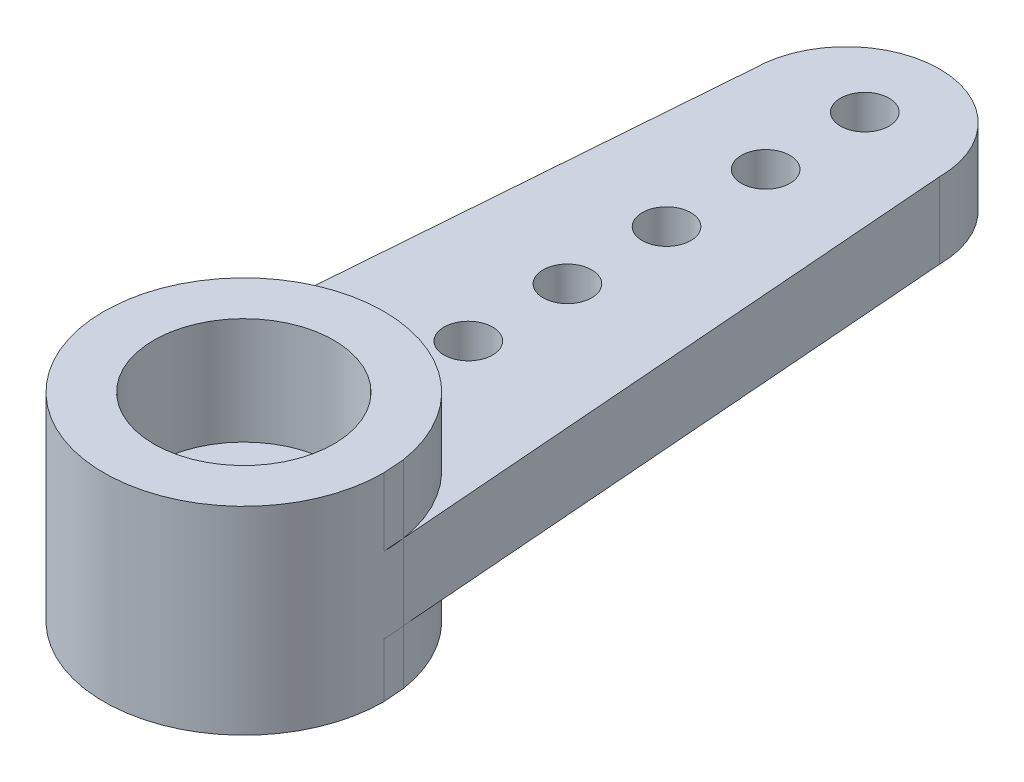
ISO-10303-21;
HEADER;
FILE_DESCRIPTION(('STEP AP214'),'2;1');
FILE_NAME('part.step','',(''),(''),'','','');
FILE_SCHEMA(('AUTOMOTIVE_DESIGN { 1 0 10303 214 1 1 1 1 }'));
ENDSEC;
DATA;
#1=APPLICATION_CONTEXT('core data for automotive mechanical design processes');
#2=APPLICATION_PROTOCOL_DEFINITION('international standard','automotive_design',2000,#1);
#3=PRODUCT_CONTEXT('',#1,'mechanical');
#4=PRODUCT('Part','Part','',(#3));
#5=PRODUCT_RELATED_PRODUCT_CATEGORY('part','',(#4));
#6=PRODUCT_DEFINITION_FORMATION('','',#4);
#7=PRODUCT_DEFINITION_CONTEXT('part definition',#1,'design');
#8=PRODUCT_DEFINITION('design','',#6,#7);
#9=PRODUCT_DEFINITION_SHAPE('','',#8);
#10=(LENGTH_UNIT() NAMED_UNIT(*) SI_UNIT(.MILLI.,.METRE.));
#11=(NAMED_UNIT(*) PLANE_ANGLE_UNIT() SI_UNIT($,.RADIAN.));
#12=(NAMED_UNIT(*) SI_UNIT($,.STERADIAN.) SOLID_ANGLE_UNIT());
#13=UNCERTAINTY_MEASURE_WITH_UNIT(LENGTH_MEASURE(1.E-05),#10,'distance_accuracy_value','');
#14=(GEOMETRIC_REPRESENTATION_CONTEXT(3) GLOBAL_UNCERTAINTY_ASSIGNED_CONTEXT((#13)) GLOBAL_UNIT_ASSIGNED_CONTEXT((#10,
#11,#12)) REPRESENTATION_CONTEXT('',''));
#15=CARTESIAN_POINT('',(0.,0.,0.));
#16=DIRECTION('',(0.,0.,1.));
#17=DIRECTION('',(1.,0.,0.));
#18=AXIS2_PLACEMENT_3D('',#15,#16,#17);
#19=CARTESIAN_POINT('',(0.,1.95,0.));
#20=DIRECTION('',(0.,-1.,0.));
#21=DIRECTION('',(0.,0.,-1.));
#22=AXIS2_PLACEMENT_3D('',#19,#20,#21);
#23=CYLINDRICAL_SURFACE('',#22,1.265);
#24=CARTESIAN_POINT('',(0.,0.,0.));
#25=DIRECTION('',(0.,1.,0.));
#26=DIRECTION('',(0.,0.,1.));
#27=AXIS2_PLACEMENT_3D('',#24,#25,#26);
#28=CIRCLE('',#27,1.265);
#29=CARTESIAN_POINT('',(0.,0.,1.265));
#30=VERTEX_POINT('',#29);
#31=EDGE_CURVE('E222',#30,#30,#28,.T.);
#32=ORIENTED_EDGE('',*,*,#31,.F.);
#33=EDGE_LOOP('',(#32));
#34=FACE_BOUND('',#33,.T.);
#35=CARTESIAN_POINT('',(0.,0.95,0.));
#36=DIRECTION('',(0.,1.,0.));
#37=DIRECTION('',(0.,0.,1.));
#38=AXIS2_PLACEMENT_3D('',#35,#36,#37);
#39=CIRCLE('',#38,1.265);
#40=CARTESIAN_POINT('',(0.,0.95,1.265));
#41=VERTEX_POINT('',#40);
#42=EDGE_CURVE('E472',#41,#41,#39,.T.);
#43=ORIENTED_EDGE('',*,*,#42,.T.);
#44=EDGE_LOOP('',(#43));
#45=FACE_BOUND('',#44,.T.);
#46=ADVANCED_FACE('F76',(#34,#45),#23,.F.);
#47=CARTESIAN_POINT('',(0.,1.95,0.));
#48=DIRECTION('',(0.,1.,0.));
#49=DIRECTION('',(0.,0.,1.));
#50=AXIS2_PLACEMENT_3D('',#47,#48,#49);
#51=PLANE('',#50);
#52=DIRECTION('',(-0.0771883762628571,0.,-0.997016526728571));
#53=VECTOR('',#52,1.);
#54=CARTESIAN_POINT('',(3.57855103645165,1.95,-0.277049112499483));
#55=LINE('',#54,#53);
#56=CARTESIAN_POINT('',(3.6,1.95,0.));
#57=VERTEX_POINT('',#56);
#58=CARTESIAN_POINT('',(3.55710207290331,1.95,-0.554098224998956));
#59=VERTEX_POINT('',#58);
#60=EDGE_CURVE('E189',#57,#59,#55,.T.);
#61=ORIENTED_EDGE('',*,*,#60,.F.);
#62=CARTESIAN_POINT('',(0.,1.95,0.));
#63=DIRECTION('',(0.,1.,0.));
#64=DIRECTION('',(0.,0.,1.));
#65=AXIS2_PLACEMENT_3D('',#62,#63,#64);
#66=CIRCLE('',#65,3.6);
#67=EDGE_CURVE('E284',#57,#59,#66,.T.);
#68=ORIENTED_EDGE('',*,*,#67,.T.);
#69=EDGE_LOOP('',(#61,#68));
#70=FACE_BOUND('',#69,.T.);
#71=ADVANCED_FACE('F311',(#70),#51,.T.);
#72=CARTESIAN_POINT('',(-3.55710207290331,1.95,-0.554098224998956));
#73=VERTEX_POINT('',#72);
#74=CARTESIAN_POINT('',(-3.6,1.95,0.));
#75=VERTEX_POINT('',#74);
#76=EDGE_CURVE('E253',#73,#75,#66,.T.);
#77=ORIENTED_EDGE('',*,*,#76,.T.);
#78=DIRECTION('',(0.0771883762628571,0.,-0.997016526728571));
#79=VECTOR('',#78,1.);
#80=CARTESIAN_POINT('',(-3.57855103645165,1.95,-0.277049112499483));
#81=LINE('',#80,#79);
#82=EDGE_CURVE('E188',#75,#73,#81,.T.);
#83=ORIENTED_EDGE('',*,*,#82,.T.);
#84=EDGE_LOOP('',(#77,#83));
#85=FACE_BOUND('',#84,.T.);
#86=ADVANCED_FACE('F318',(#85),#51,.T.);
#87=CARTESIAN_POINT('',(0.,0.,0.));
#88=DIRECTION('',(0.,1.,0.));
#89=DIRECTION('',(0.,0.,1.));
#90=AXIS2_PLACEMENT_3D('',#87,#88,#89);
#91=PLANE('',#90);
#92=ORIENTED_EDGE('',*,*,#31,.T.);
#93=EDGE_LOOP('',(#92));
#94=FACE_BOUND('',#93,.T.);
#95=CARTESIAN_POINT('',(0.,0.,0.));
#96=DIRECTION('',(0.,1.,0.));
#97=DIRECTION('',(0.,0.,1.));
#98=AXIS2_PLACEMENT_3D('',#95,#96,#97);
#99=CIRCLE('',#98,2.315);
#100=CARTESIAN_POINT('',(0.,0.,2.315));
#101=VERTEX_POINT('',#100);
#102=EDGE_CURVE('E85',#101,#101,#99,.T.);
#103=ORIENTED_EDGE('',*,*,#102,.F.);
#104=EDGE_LOOP('',(#103));
#105=FACE_BOUND('',#104,.T.);
#106=ADVANCED_FACE('F320',(#94,#105),#91,.F.);
#107=DIRECTION('',(0.0771883762628571,0.,0.997016526728571));
#108=VECTOR('',#107,1.);
#109=CARTESIAN_POINT('',(3.57855103645165,0.,-0.277049112499483));
#110=LINE('',#109,#108);
#111=CARTESIAN_POINT('',(3.55710207290331,0.,-0.554098224998956));
#112=VERTEX_POINT('',#111);
#113=CARTESIAN_POINT('',(3.6,0.,0.));
#114=VERTEX_POINT('',#113);
#115=EDGE_CURVE('E215',#112,#114,#110,.T.);
#116=ORIENTED_EDGE('',*,*,#115,.F.);
#117=CARTESIAN_POINT('',(0.,0.,0.));
#118=DIRECTION('',(0.,1.,0.));
#119=DIRECTION('',(0.,0.,1.));
#120=AXIS2_PLACEMENT_3D('',#117,#118,#119);
#121=CIRCLE('',#120,3.6);
#122=EDGE_CURVE('E283',#114,#112,#121,.T.);
#123=ORIENTED_EDGE('',*,*,#122,.F.);
#124=EDGE_LOOP('',(#116,#123));
#125=FACE_BOUND('',#124,.T.);
#126=ADVANCED_FACE('F327',(#125),#91,.F.);
#127=CARTESIAN_POINT('',(-3.55710207290331,0.,-0.554098224998956));
#128=VERTEX_POINT('',#127);
#129=CARTESIAN_POINT('',(-3.6,0.,0.));
#130=VERTEX_POINT('',#129);
#131=EDGE_CURVE('E285',#128,#130,#121,.T.);
#132=ORIENTED_EDGE('',*,*,#131,.F.);
#133=DIRECTION('',(-0.0771883762628571,0.,0.997016526728571));
#134=VECTOR('',#133,1.);
#135=CARTESIAN_POINT('',(-3.57855103645165,0.,-0.277049112499483));
#136=LINE('',#135,#134);
#137=EDGE_CURVE('E109',#128,#130,#136,.T.);
#138=ORIENTED_EDGE('',*,*,#137,.T.);
#139=EDGE_LOOP('',(#132,#138));
#140=FACE_BOUND('',#139,.T.);
#141=ADVANCED_FACE('F364',(#140),#91,.F.);
#142=CARTESIAN_POINT('',(0.,1.95,-8.325));
#143=DIRECTION('',(0.,-1.,0.));
#144=DIRECTION('',(0.,0.,-1.));
#145=AXIS2_PLACEMENT_3D('',#142,#143,#144);
#146=CYLINDRICAL_SURFACE('',#145,0.625000000000001);
#147=CARTESIAN_POINT('',(0.,1.95,-8.325));
#148=DIRECTION('',(0.,1.,0.));
#149=DIRECTION('',(0.,0.,1.));
#150=AXIS2_PLACEMENT_3D('',#147,#148,#149);
#151=CIRCLE('',#150,0.625000000000001);
#152=CARTESIAN_POINT('',(0.,1.95,-7.7));
#153=VERTEX_POINT('',#152);
#154=EDGE_CURVE('E247',#153,#153,#151,.T.);
#155=ORIENTED_EDGE('',*,*,#154,.T.);
#156=EDGE_LOOP('',(#155));
#157=FACE_BOUND('',#156,.T.);
#158=CARTESIAN_POINT('',(0.,0.,-8.325));
#159=DIRECTION('',(0.,1.,0.));
#160=DIRECTION('',(0.,0.,1.));
#161=AXIS2_PLACEMENT_3D('',#158,#159,#160);
#162=CIRCLE('',#161,0.625000000000001);
#163=CARTESIAN_POINT('',(0.,0.,-7.7));
#164=VERTEX_POINT('',#163);
#165=EDGE_CURVE('E231',#164,#164,#162,.T.);
#166=ORIENTED_EDGE('',*,*,#165,.F.);
#167=EDGE_LOOP('',(#166));
#168=FACE_BOUND('',#167,.T.);
#169=ADVANCED_FACE('F361',(#157,#168),#146,.F.);
#170=CARTESIAN_POINT('',(0.,1.95,-10.875));
#171=DIRECTION('',(0.,-1.,0.));
#172=DIRECTION('',(0.,0.,-1.));
#173=AXIS2_PLACEMENT_3D('',#170,#171,#172);
#174=CYLINDRICAL_SURFACE('',#173,0.625000000000001);
#175=CARTESIAN_POINT('',(0.,1.95,-10.875));
#176=DIRECTION('',(0.,1.,0.));
#177=DIRECTION('',(0.,0.,1.));
#178=AXIS2_PLACEMENT_3D('',#175,#176,#177);
#179=CIRCLE('',#178,0.625000000000001);
#180=CARTESIAN_POINT('',(0.,1.95,-10.25));
#181=VERTEX_POINT('',#180);
#182=EDGE_CURVE('E244',#181,#181,#179,.T.);
#183=ORIENTED_EDGE('',*,*,#182,.T.);
#184=EDGE_LOOP('',(#183));
#185=FACE_BOUND('',#184,.T.);
#186=CARTESIAN_POINT('',(0.,0.,-10.875));
#187=DIRECTION('',(0.,1.,0.));
#188=DIRECTION('',(0.,0.,1.));
#189=AXIS2_PLACEMENT_3D('',#186,#187,#188);
#190=CIRCLE('',#189,0.625000000000001);
#191=CARTESIAN_POINT('',(0.,0.,-10.25));
#192=VERTEX_POINT('',#191);
#193=EDGE_CURVE('E268',#192,#192,#190,.T.);
#194=ORIENTED_EDGE('',*,*,#193,.F.);
#195=EDGE_LOOP('',(#194));
#196=FACE_BOUND('',#195,.T.);
#197=ADVANCED_FACE('F357',(#185,#196),#174,.F.);
#198=CARTESIAN_POINT('',(0.,1.95,-13.425));
#199=DIRECTION('',(0.,-1.,0.));
#200=DIRECTION('',(0.,0.,-1.));
#201=AXIS2_PLACEMENT_3D('',#198,#199,#200);
#202=CYLINDRICAL_SURFACE('',#201,0.625000000000001);
#203=CARTESIAN_POINT('',(0.,1.95,-13.425));
#204=DIRECTION('',(0.,1.,0.));
#205=DIRECTION('',(0.,0.,1.));
#206=AXIS2_PLACEMENT_3D('',#203,#204,#205);
#207=CIRCLE('',#206,0.625000000000001);
#208=CARTESIAN_POINT('',(0.,1.95,-12.8));
#209=VERTEX_POINT('',#208);
#210=EDGE_CURVE('E241',#209,#209,#207,.T.);
#211=ORIENTED_EDGE('',*,*,#210,.T.);
#212=EDGE_LOOP('',(#211));
#213=FACE_BOUND('',#212,.T.);
#214=CARTESIAN_POINT('',(0.,0.,-13.425));
#215=DIRECTION('',(0.,1.,0.));
#216=DIRECTION('',(0.,0.,1.));
#217=AXIS2_PLACEMENT_3D('',#214,#215,#216);
#218=CIRCLE('',#217,0.625000000000001);
#219=CARTESIAN_POINT('',(0.,0.,-12.8));
#220=VERTEX_POINT('',#219);
#221=EDGE_CURVE('E265',#220,#220,#218,.T.);
#222=ORIENTED_EDGE('',*,*,#221,.F.);
#223=EDGE_LOOP('',(#222));
#224=FACE_BOUND('',#223,.T.);
#225=ADVANCED_FACE('F353',(#213,#224),#202,.F.);
#226=CARTESIAN_POINT('',(0.,1.95,-5.775));
#227=DIRECTION('',(0.,-1.,0.));
#228=DIRECTION('',(0.,0.,-1.));
#229=AXIS2_PLACEMENT_3D('',#226,#227,#228);
#230=CYLINDRICAL_SURFACE('',#229,0.625000000000001);
#231=CARTESIAN_POINT('',(0.,1.95,-5.775));
#232=DIRECTION('',(0.,1.,0.));
#233=DIRECTION('',(0.,0.,1.));
#234=AXIS2_PLACEMENT_3D('',#231,#232,#233);
#235=CIRCLE('',#234,0.625000000000001);
#236=CARTESIAN_POINT('',(0.,1.95,-5.15));
#237=VERTEX_POINT('',#236);
#238=EDGE_CURVE('E238',#237,#237,#235,.T.);
#239=ORIENTED_EDGE('',*,*,#238,.T.);
#240=EDGE_LOOP('',(#239));
#241=FACE_BOUND('',#240,.T.);
#242=CARTESIAN_POINT('',(0.,0.,-5.775));
#243=DIRECTION('',(0.,1.,0.));
#244=DIRECTION('',(0.,0.,1.));
#245=AXIS2_PLACEMENT_3D('',#242,#243,#244);
#246=CIRCLE('',#245,0.625000000000001);
#247=CARTESIAN_POINT('',(0.,0.,-5.15));
#248=VERTEX_POINT('',#247);
#249=EDGE_CURVE('E262',#248,#248,#246,.T.);
#250=ORIENTED_EDGE('',*,*,#249,.F.);
#251=EDGE_LOOP('',(#250));
#252=FACE_BOUND('',#251,.T.);
#253=ADVANCED_FACE('F349',(#241,#252),#230,.F.);
#254=CARTESIAN_POINT('',(0.,1.95,-15.975));
#255=DIRECTION('',(0.,-1.,0.));
#256=DIRECTION('',(0.,0.,-1.));
#257=AXIS2_PLACEMENT_3D('',#254,#255,#256);
#258=CYLINDRICAL_SURFACE('',#257,0.625000000000001);
#259=CARTESIAN_POINT('',(0.,1.95,-15.975));
#260=DIRECTION('',(0.,1.,0.));
#261=DIRECTION('',(0.,0.,1.));
#262=AXIS2_PLACEMENT_3D('',#259,#260,#261);
#263=CIRCLE('',#262,0.625000000000001);
#264=CARTESIAN_POINT('',(0.,1.95,-15.35));
#265=VERTEX_POINT('',#264);
#266=EDGE_CURVE('E235',#265,#265,#263,.T.);
#267=ORIENTED_EDGE('',*,*,#266,.T.);
#268=EDGE_LOOP('',(#267));
#269=FACE_BOUND('',#268,.T.);
#270=CARTESIAN_POINT('',(0.,0.,-15.975));
#271=DIRECTION('',(0.,1.,0.));
#272=DIRECTION('',(0.,0.,1.));
#273=AXIS2_PLACEMENT_3D('',#270,#271,#272);
#274=CIRCLE('',#273,0.625000000000001);
#275=CARTESIAN_POINT('',(0.,0.,-15.35));
#276=VERTEX_POINT('',#275);
#277=EDGE_CURVE('E259',#276,#276,#274,.T.);
#278=ORIENTED_EDGE('',*,*,#277,.F.);
#279=EDGE_LOOP('',(#278));
#280=FACE_BOUND('',#279,.T.);
#281=ADVANCED_FACE('F344',(#269,#280),#258,.F.);
#282=CARTESIAN_POINT('',(-3.57855103645165,1.95,-0.277049112499483));
#283=DIRECTION('',(0.997016526728571,0.,0.0771883762628571));
#284=DIRECTION('',(0.0771883762628571,0.,-0.997016526728571));
#285=AXIS2_PLACEMENT_3D('',#282,#283,#284);
#286=PLANE('',#285);
#287=DIRECTION('',(-0.0771883762628571,0.,0.997016526728571));
#288=VECTOR('',#287,1.);
#289=CARTESIAN_POINT('',(-3.57855103645165,0.,-0.277049112499483));
#290=LINE('',#289,#288);
#291=CARTESIAN_POINT('',(-2.4,0.,-15.5));
#292=VERTEX_POINT('',#291);
#293=EDGE_CURVE('E252',#292,#128,#290,.T.);
#294=ORIENTED_EDGE('',*,*,#293,.T.);
#295=DIRECTION('',(0.,-1.,0.));
#296=VECTOR('',#295,1.);
#297=CARTESIAN_POINT('',(-3.55710207290331,1.95,-0.554098224998956));
#298=LINE('',#297,#296);
#299=EDGE_CURVE('E277',#73,#128,#298,.T.);
#300=ORIENTED_EDGE('',*,*,#299,.F.);
#301=DIRECTION('',(-0.0771883762628571,0.,0.997016526728571));
#302=VECTOR('',#301,1.);
#303=CARTESIAN_POINT('',(-3.57855103645165,1.95,-0.277049112499483));
#304=LINE('',#303,#302);
#305=CARTESIAN_POINT('',(-2.4,1.95,-15.5));
#306=VERTEX_POINT('',#305);
#307=EDGE_CURVE('E119',#306,#73,#304,.T.);
#308=ORIENTED_EDGE('',*,*,#307,.F.);
#309=DIRECTION('',(0.,-1.,0.));
#310=VECTOR('',#309,1.);
#311=CARTESIAN_POINT('',(-2.4,1.95,-15.5));
#312=LINE('',#311,#310);
#313=EDGE_CURVE('E213',#306,#292,#312,.T.);
#314=ORIENTED_EDGE('',*,*,#313,.T.);
#315=EDGE_LOOP('',(#294,#300,#308,#314));
#316=FACE_BOUND('',#315,.T.);
#317=ADVANCED_FACE('F303',(#316),#286,.F.);
#318=CARTESIAN_POINT('',(3.57855103645165,1.95,-0.277049112499483));
#319=DIRECTION('',(0.997016526728571,0.,-0.0771883762628571));
#320=DIRECTION('',(-0.0771883762628571,0.,-0.997016526728571));
#321=AXIS2_PLACEMENT_3D('',#318,#319,#320);
#322=PLANE('',#321);
#323=DIRECTION('',(0.0771883762628571,0.,0.997016526728571));
#324=VECTOR('',#323,1.);
#325=CARTESIAN_POINT('',(3.57855103645165,0.,-0.277049112499483));
#326=LINE('',#325,#324);
#327=CARTESIAN_POINT('',(2.4,0.,-15.5));
#328=VERTEX_POINT('',#327);
#329=EDGE_CURVE('E256',#328,#112,#326,.T.);
#330=ORIENTED_EDGE('',*,*,#329,.F.);
#331=DIRECTION('',(0.,-1.,0.));
#332=VECTOR('',#331,1.);
#333=CARTESIAN_POINT('',(2.4,1.95,-15.5));
#334=LINE('',#333,#332);
#335=CARTESIAN_POINT('',(2.4,1.95,-15.5));
#336=VERTEX_POINT('',#335);
#337=EDGE_CURVE('E93',#336,#328,#334,.T.);
#338=ORIENTED_EDGE('',*,*,#337,.F.);
#339=DIRECTION('',(0.0771883762628571,0.,0.997016526728571));
#340=VECTOR('',#339,1.);
#341=CARTESIAN_POINT('',(3.57855103645165,1.95,-0.277049112499483));
#342=LINE('',#341,#340);
#343=EDGE_CURVE('E233',#336,#59,#342,.T.);
#344=ORIENTED_EDGE('',*,*,#343,.T.);
#345=DIRECTION('',(0.,-1.,0.));
#346=VECTOR('',#345,1.);
#347=CARTESIAN_POINT('',(3.55710207290331,1.95,-0.554098224998956));
#348=LINE('',#347,#346);
#349=EDGE_CURVE('E274',#59,#112,#348,.T.);
#350=ORIENTED_EDGE('',*,*,#349,.T.);
#351=EDGE_LOOP('',(#330,#338,#344,#350));
#352=FACE_BOUND('',#351,.T.);
#353=ADVANCED_FACE('F295',(#352),#322,.T.);
#354=CARTESIAN_POINT('',(0.,1.95,-15.5));
#355=DIRECTION('',(0.,-1.,0.));
#356=DIRECTION('',(0.,0.,-1.));
#357=AXIS2_PLACEMENT_3D('',#354,#355,#356);
#358=CYLINDRICAL_SURFACE('',#357,2.4);
#359=CARTESIAN_POINT('',(0.,0.,-15.5));
#360=DIRECTION('',(0.,1.,0.));
#361=DIRECTION('',(0.,0.,1.));
#362=AXIS2_PLACEMENT_3D('',#359,#360,#361);
#363=CIRCLE('',#362,2.4);
#364=EDGE_CURVE('E250',#328,#292,#363,.T.);
#365=ORIENTED_EDGE('',*,*,#364,.T.);
#366=ORIENTED_EDGE('',*,*,#313,.F.);
#367=CARTESIAN_POINT('',(0.,1.95,-15.5));
#368=DIRECTION('',(0.,1.,0.));
#369=DIRECTION('',(0.,0.,1.));
#370=AXIS2_PLACEMENT_3D('',#367,#368,#369);
#371=CIRCLE('',#370,2.4);
#372=EDGE_CURVE('E229',#336,#306,#371,.T.);
#373=ORIENTED_EDGE('',*,*,#372,.F.);
#374=ORIENTED_EDGE('',*,*,#337,.T.);
#375=EDGE_LOOP('',(#365,#366,#373,#374));
#376=FACE_BOUND('',#375,.T.);
#377=ADVANCED_FACE('F302',(#376),#358,.T.);
#378=ORIENTED_EDGE('',*,*,#329,.T.);
#379=CARTESIAN_POINT('',(0.,0.,0.));
#380=DIRECTION('',(0.,1.,0.));
#381=DIRECTION('',(0.,0.,1.));
#382=AXIS2_PLACEMENT_3D('',#379,#380,#381);
#383=CIRCLE('',#382,3.6);
#384=EDGE_CURVE('E202',#112,#128,#383,.T.);
#385=ORIENTED_EDGE('',*,*,#384,.T.);
#386=ORIENTED_EDGE('',*,*,#293,.F.);
#387=ORIENTED_EDGE('',*,*,#364,.F.);
#388=EDGE_LOOP('',(#378,#385,#386,#387));
#389=FACE_BOUND('',#388,.T.);
#390=ORIENTED_EDGE('',*,*,#277,.T.);
#391=EDGE_LOOP('',(#390));
#392=FACE_BOUND('',#391,.T.);
#393=ORIENTED_EDGE('',*,*,#249,.T.);
#394=EDGE_LOOP('',(#393));
#395=FACE_BOUND('',#394,.T.);
#396=ORIENTED_EDGE('',*,*,#221,.T.);
#397=EDGE_LOOP('',(#396));
#398=FACE_BOUND('',#397,.T.);
#399=ORIENTED_EDGE('',*,*,#193,.T.);
#400=EDGE_LOOP('',(#399));
#401=FACE_BOUND('',#400,.T.);
#402=ORIENTED_EDGE('',*,*,#165,.T.);
#403=EDGE_LOOP('',(#402));
#404=FACE_BOUND('',#403,.T.);
#405=ADVANCED_FACE('F298',(#389,#392,#395,#398,#401,#404),#91,.F.);
#406=ORIENTED_EDGE('',*,*,#307,.T.);
#407=CARTESIAN_POINT('',(0.,1.95,0.));
#408=DIRECTION('',(0.,1.,0.));
#409=DIRECTION('',(0.,0.,1.));
#410=AXIS2_PLACEMENT_3D('',#407,#408,#409);
#411=CIRCLE('',#410,3.6);
#412=EDGE_CURVE('E12',#73,#59,#411,.F.);
#413=ORIENTED_EDGE('',*,*,#412,.T.);
#414=ORIENTED_EDGE('',*,*,#343,.F.);
#415=ORIENTED_EDGE('',*,*,#372,.T.);
#416=EDGE_LOOP('',(#406,#413,#414,#415));
#417=FACE_BOUND('',#416,.T.);
#418=ORIENTED_EDGE('',*,*,#266,.F.);
#419=EDGE_LOOP('',(#418));
#420=FACE_BOUND('',#419,.T.);
#421=ORIENTED_EDGE('',*,*,#238,.F.);
#422=EDGE_LOOP('',(#421));
#423=FACE_BOUND('',#422,.T.);
#424=ORIENTED_EDGE('',*,*,#210,.F.);
#425=EDGE_LOOP('',(#424));
#426=FACE_BOUND('',#425,.T.);
#427=ORIENTED_EDGE('',*,*,#182,.F.);
#428=EDGE_LOOP('',(#427));
#429=FACE_BOUND('',#428,.T.);
#430=ORIENTED_EDGE('',*,*,#154,.F.);
#431=EDGE_LOOP('',(#430));
#432=FACE_BOUND('',#431,.T.);
#433=ADVANCED_FACE('F306',(#417,#420,#423,#426,#429,#432),#51,.T.);
#434=CARTESIAN_POINT('',(0.,1.95,0.));
#435=DIRECTION('',(0.,-1.,0.));
#436=DIRECTION('',(0.,0.,-1.));
#437=AXIS2_PLACEMENT_3D('',#434,#435,#436);
#438=CYLINDRICAL_SURFACE('',#437,3.6);
#439=ORIENTED_EDGE('',*,*,#67,.F.);
#440=DIRECTION('',(0.,-1.,0.));
#441=VECTOR('',#440,1.);
#442=CARTESIAN_POINT('',(3.6,3.7,0.));
#443=LINE('',#442,#441);
#444=CARTESIAN_POINT('',(3.6,3.7,0.));
#445=VERTEX_POINT('',#444);
#446=EDGE_CURVE('E170',#445,#57,#443,.T.);
#447=ORIENTED_EDGE('',*,*,#446,.F.);
#448=CARTESIAN_POINT('',(0.,3.7,0.));
#449=DIRECTION('',(0.,1.,0.));
#450=DIRECTION('',(0.,0.,1.));
#451=AXIS2_PLACEMENT_3D('',#448,#449,#450);
#452=CIRCLE('',#451,3.6);
#453=CARTESIAN_POINT('',(-3.6,3.7,0.));
#454=VERTEX_POINT('',#453);
#455=EDGE_CURVE('E163',#454,#445,#452,.T.);
#456=ORIENTED_EDGE('',*,*,#455,.F.);
#457=DIRECTION('',(0.,-1.,0.));
#458=VECTOR('',#457,1.);
#459=CARTESIAN_POINT('',(-3.6,3.7,0.));
#460=LINE('',#459,#458);
#461=EDGE_CURVE('E168',#454,#75,#460,.T.);
#462=ORIENTED_EDGE('',*,*,#461,.T.);
#463=ORIENTED_EDGE('',*,*,#76,.F.);
#464=ORIENTED_EDGE('',*,*,#299,.T.);
#465=ORIENTED_EDGE('',*,*,#131,.T.);
#466=DIRECTION('',(0.,1.,0.));
#467=VECTOR('',#466,1.);
#468=CARTESIAN_POINT('',(-3.6,-1.4,0.));
#469=LINE('',#468,#467);
#470=CARTESIAN_POINT('',(-3.6,-1.4,0.));
#471=VERTEX_POINT('',#470);
#472=EDGE_CURVE('E227',#471,#130,#469,.T.);
#473=ORIENTED_EDGE('',*,*,#472,.F.);
#474=CARTESIAN_POINT('',(0.,-1.4,0.));
#475=DIRECTION('',(0.,1.,0.));
#476=DIRECTION('',(0.,0.,1.));
#477=AXIS2_PLACEMENT_3D('',#474,#475,#476);
#478=CIRCLE('',#477,3.6);
#479=CARTESIAN_POINT('',(3.6,-1.4,0.));
#480=VERTEX_POINT('',#479);
#481=EDGE_CURVE('E205',#471,#480,#478,.T.);
#482=ORIENTED_EDGE('',*,*,#481,.T.);
#483=DIRECTION('',(0.,1.,0.));
#484=VECTOR('',#483,1.);
#485=CARTESIAN_POINT('',(3.6,-1.4,0.));
#486=LINE('',#485,#484);
#487=EDGE_CURVE('E225',#480,#114,#486,.T.);
#488=ORIENTED_EDGE('',*,*,#487,.T.);
#489=ORIENTED_EDGE('',*,*,#122,.T.);
#490=ORIENTED_EDGE('',*,*,#349,.F.);
#491=EDGE_LOOP('',(#439,#447,#456,#462,#463,#464,#465,#473,#482,#488,#489,#490));
#492=FACE_BOUND('',#491,.T.);
#493=ADVANCED_FACE('F78',(#492),#438,.T.);
#494=CARTESIAN_POINT('',(-3.57855103645165,-1.4,-0.277049112499483));
#495=DIRECTION('',(-0.997016526728571,0.,-0.0771883762628571));
#496=DIRECTION('',(-0.0771883762628571,0.,0.997016526728571));
#497=AXIS2_PLACEMENT_3D('',#494,#495,#496);
#498=PLANE('',#497);
#499=ORIENTED_EDGE('',*,*,#137,.F.);
#500=DIRECTION('',(0.,1.,0.));
#501=VECTOR('',#500,1.);
#502=CARTESIAN_POINT('',(-3.55710207290331,-1.4,-0.554098224998956));
#503=LINE('',#502,#501);
#504=CARTESIAN_POINT('',(-3.55710207290331,-1.4,-0.554098224998956));
#505=VERTEX_POINT('',#504);
#506=EDGE_CURVE('E220',#505,#128,#503,.T.);
#507=ORIENTED_EDGE('',*,*,#506,.F.);
#508=DIRECTION('',(-0.0771883762628571,0.,0.997016526728571));
#509=VECTOR('',#508,1.);
#510=CARTESIAN_POINT('',(-3.57855103645165,-1.4,-0.277049112499483));
#511=LINE('',#510,#509);
#512=EDGE_CURVE('E201',#505,#471,#511,.T.);
#513=ORIENTED_EDGE('',*,*,#512,.T.);
#514=ORIENTED_EDGE('',*,*,#472,.T.);
#515=EDGE_LOOP('',(#499,#507,#513,#514));
#516=FACE_BOUND('',#515,.T.);
#517=ADVANCED_FACE('F385',(#516),#498,.T.);
#518=CARTESIAN_POINT('',(0.,-1.4,0.));
#519=DIRECTION('',(0.,1.,0.));
#520=DIRECTION('',(0.,0.,1.));
#521=AXIS2_PLACEMENT_3D('',#518,#519,#520);
#522=CYLINDRICAL_SURFACE('',#521,3.6);
#523=ORIENTED_EDGE('',*,*,#384,.F.);
#524=DIRECTION('',(0.,1.,0.));
#525=VECTOR('',#524,1.);
#526=CARTESIAN_POINT('',(3.55710207290331,-1.4,-0.554098224998956));
#527=LINE('',#526,#525);
#528=CARTESIAN_POINT('',(3.55710207290331,-1.4,-0.554098224998956));
#529=VERTEX_POINT('',#528);
#530=EDGE_CURVE('E223',#529,#112,#527,.T.);
#531=ORIENTED_EDGE('',*,*,#530,.F.);
#532=EDGE_CURVE('E209',#529,#505,#478,.T.);
#533=ORIENTED_EDGE('',*,*,#532,.T.);
#534=ORIENTED_EDGE('',*,*,#506,.T.);
#535=EDGE_LOOP('',(#523,#531,#533,#534));
#536=FACE_BOUND('',#535,.T.);
#537=ADVANCED_FACE('F383',(#536),#522,.T.);
#538=CARTESIAN_POINT('',(3.57855103645165,-1.4,-0.277049112499483));
#539=DIRECTION('',(-0.997016526728571,0.,0.0771883762628571));
#540=DIRECTION('',(0.0771883762628571,0.,0.997016526728571));
#541=AXIS2_PLACEMENT_3D('',#538,#539,#540);
#542=PLANE('',#541);
#543=ORIENTED_EDGE('',*,*,#115,.T.);
#544=ORIENTED_EDGE('',*,*,#487,.F.);
#545=DIRECTION('',(0.0771883762628571,0.,0.997016526728571));
#546=VECTOR('',#545,1.);
#547=CARTESIAN_POINT('',(3.57855103645165,-1.4,-0.277049112499483));
#548=LINE('',#547,#546);
#549=EDGE_CURVE('E208',#529,#480,#548,.T.);
#550=ORIENTED_EDGE('',*,*,#549,.F.);
#551=ORIENTED_EDGE('',*,*,#530,.T.);
#552=EDGE_LOOP('',(#543,#544,#550,#551));
#553=FACE_BOUND('',#552,.T.);
#554=ADVANCED_FACE('F378',(#553),#542,.F.);
#555=CARTESIAN_POINT('',(0.,-1.4,0.));
#556=DIRECTION('',(0.,1.,0.));
#557=DIRECTION('',(0.,0.,1.));
#558=AXIS2_PLACEMENT_3D('',#555,#556,#557);
#559=CYLINDRICAL_SURFACE('',#558,2.315);
#560=CARTESIAN_POINT('',(0.,-1.4,0.));
#561=DIRECTION('',(0.,1.,0.));
#562=DIRECTION('',(0.,0.,1.));
#563=AXIS2_PLACEMENT_3D('',#560,#561,#562);
#564=CIRCLE('',#563,2.315);
#565=CARTESIAN_POINT('',(0.,-1.4,2.315));
#566=VERTEX_POINT('',#565);
#567=EDGE_CURVE('E198',#566,#566,#564,.T.);
#568=ORIENTED_EDGE('',*,*,#567,.F.);
#569=EDGE_LOOP('',(#568));
#570=FACE_BOUND('',#569,.T.);
#571=ORIENTED_EDGE('',*,*,#102,.T.);
#572=EDGE_LOOP('',(#571));
#573=FACE_BOUND('',#572,.T.);
#574=ADVANCED_FACE('F390',(#570,#573),#559,.F.);
#575=CARTESIAN_POINT('',(0.,-1.4,0.));
#576=DIRECTION('',(0.,1.,0.));
#577=DIRECTION('',(0.,0.,1.));
#578=AXIS2_PLACEMENT_3D('',#575,#576,#577);
#579=PLANE('',#578);
#580=ORIENTED_EDGE('',*,*,#567,.T.);
#581=EDGE_LOOP('',(#580));
#582=FACE_BOUND('',#581,.T.);
#583=ORIENTED_EDGE('',*,*,#512,.F.);
#584=ORIENTED_EDGE('',*,*,#532,.F.);
#585=ORIENTED_EDGE('',*,*,#549,.T.);
#586=ORIENTED_EDGE('',*,*,#481,.F.);
#587=EDGE_LOOP('',(#583,#584,#585,#586));
#588=FACE_BOUND('',#587,.T.);
#589=ADVANCED_FACE('F388',(#582,#588),#579,.F.);
#590=CARTESIAN_POINT('',(-3.57855103645165,3.7,-0.277049112499483));
#591=DIRECTION('',(0.997016526728571,0.,0.0771883762628571));
#592=DIRECTION('',(0.0771883762628571,0.,-0.997016526728571));
#593=AXIS2_PLACEMENT_3D('',#590,#591,#592);
#594=PLANE('',#593);
#595=ORIENTED_EDGE('',*,*,#82,.F.);
#596=ORIENTED_EDGE('',*,*,#461,.F.);
#597=DIRECTION('',(-0.0771883762628571,0.,0.997016526728571));
#598=VECTOR('',#597,1.);
#599=CARTESIAN_POINT('',(-3.57855103645165,3.7,-0.277049112499483));
#600=LINE('',#599,#598);
#601=CARTESIAN_POINT('',(-3.55710207290331,3.7,-0.554098224998956));
#602=VERTEX_POINT('',#601);
#603=EDGE_CURVE('E175',#602,#454,#600,.T.);
#604=ORIENTED_EDGE('',*,*,#603,.F.);
#605=DIRECTION('',(0.,-1.,0.));
#606=VECTOR('',#605,1.);
#607=CARTESIAN_POINT('',(-3.55710207290331,3.7,-0.554098224998956));
#608=LINE('',#607,#606);
#609=EDGE_CURVE('E315',#602,#73,#608,.T.);
#610=ORIENTED_EDGE('',*,*,#609,.T.);
#611=EDGE_LOOP('',(#595,#596,#604,#610));
#612=FACE_BOUND('',#611,.T.);
#613=ADVANCED_FACE('F186',(#612),#594,.F.);
#614=CARTESIAN_POINT('',(3.57855103645165,3.7,-0.277049112499483));
#615=DIRECTION('',(0.997016526728571,0.,-0.0771883762628571));
#616=DIRECTION('',(-0.0771883762628571,0.,-0.997016526728571));
#617=AXIS2_PLACEMENT_3D('',#614,#615,#616);
#618=PLANE('',#617);
#619=ORIENTED_EDGE('',*,*,#446,.T.);
#620=ORIENTED_EDGE('',*,*,#60,.T.);
#621=DIRECTION('',(0.,-1.,0.));
#622=VECTOR('',#621,1.);
#623=CARTESIAN_POINT('',(3.55710207290331,3.7,-0.554098224998956));
#624=LINE('',#623,#622);
#625=CARTESIAN_POINT('',(3.55710207290331,3.7,-0.554098224998956));
#626=VERTEX_POINT('',#625);
#627=EDGE_CURVE('E193',#626,#59,#624,.T.);
#628=ORIENTED_EDGE('',*,*,#627,.F.);
#629=DIRECTION('',(0.0771883762628571,0.,0.997016526728571));
#630=VECTOR('',#629,1.);
#631=CARTESIAN_POINT('',(3.57855103645165,3.7,-0.277049112499483));
#632=LINE('',#631,#630);
#633=EDGE_CURVE('E174',#626,#445,#632,.T.);
#634=ORIENTED_EDGE('',*,*,#633,.T.);
#635=EDGE_LOOP('',(#619,#620,#628,#634));
#636=FACE_BOUND('',#635,.T.);
#637=ADVANCED_FACE('F313',(#636),#618,.T.);
#638=CARTESIAN_POINT('',(0.,3.7,0.));
#639=DIRECTION('',(0.,-1.,0.));
#640=DIRECTION('',(0.,0.,-1.));
#641=AXIS2_PLACEMENT_3D('',#638,#639,#640);
#642=CYLINDRICAL_SURFACE('',#641,2.315);
#643=CARTESIAN_POINT('',(0.,3.7,0.));
#644=DIRECTION('',(0.,1.,0.));
#645=DIRECTION('',(0.,0.,1.));
#646=AXIS2_PLACEMENT_3D('',#643,#644,#645);
#647=CIRCLE('',#646,2.315);
#648=CARTESIAN_POINT('',(0.,3.7,2.315));
#649=VERTEX_POINT('',#648);
#650=EDGE_CURVE('E184',#649,#649,#647,.T.);
#651=ORIENTED_EDGE('',*,*,#650,.T.);
#652=EDGE_LOOP('',(#651));
#653=FACE_BOUND('',#652,.T.);
#654=CARTESIAN_POINT('',(0.,0.95,0.));
#655=DIRECTION('',(0.,1.,0.));
#656=DIRECTION('',(0.,0.,1.));
#657=AXIS2_PLACEMENT_3D('',#654,#655,#656);
#658=CIRCLE('',#657,2.315);
#659=CARTESIAN_POINT('',(0.,0.95,2.315));
#660=VERTEX_POINT('',#659);
#661=EDGE_CURVE('E475',#660,#660,#658,.T.);
#662=ORIENTED_EDGE('',*,*,#661,.F.);
#663=EDGE_LOOP('',(#662));
#664=FACE_BOUND('',#663,.T.);
#665=ADVANCED_FACE('F401',(#653,#664),#642,.F.);
#666=CARTESIAN_POINT('',(0.,3.7,0.));
#667=DIRECTION('',(0.,-1.,0.));
#668=DIRECTION('',(0.,0.,-1.));
#669=AXIS2_PLACEMENT_3D('',#666,#667,#668);
#670=CYLINDRICAL_SURFACE('',#669,3.6);
#671=ORIENTED_EDGE('',*,*,#412,.F.);
#672=ORIENTED_EDGE('',*,*,#609,.F.);
#673=EDGE_CURVE('E177',#626,#602,#452,.T.);
#674=ORIENTED_EDGE('',*,*,#673,.F.);
#675=ORIENTED_EDGE('',*,*,#627,.T.);
#676=EDGE_LOOP('',(#671,#672,#674,#675));
#677=FACE_BOUND('',#676,.T.);
#678=ADVANCED_FACE('F317',(#677),#670,.T.);
#679=CARTESIAN_POINT('',(0.,3.7,0.));
#680=DIRECTION('',(0.,1.,0.));
#681=DIRECTION('',(0.,0.,1.));
#682=AXIS2_PLACEMENT_3D('',#679,#680,#681);
#683=PLANE('',#682);
#684=ORIENTED_EDGE('',*,*,#650,.F.);
#685=EDGE_LOOP('',(#684));
#686=FACE_BOUND('',#685,.T.);
#687=ORIENTED_EDGE('',*,*,#603,.T.);
#688=ORIENTED_EDGE('',*,*,#455,.T.);
#689=ORIENTED_EDGE('',*,*,#633,.F.);
#690=ORIENTED_EDGE('',*,*,#673,.T.);
#691=EDGE_LOOP('',(#687,#688,#689,#690));
#692=FACE_BOUND('',#691,.T.);
#693=ADVANCED_FACE('F179',(#686,#692),#683,.T.);
#694=CARTESIAN_POINT('',(0.,0.95,0.));
#695=DIRECTION('',(0.,1.,0.));
#696=DIRECTION('',(0.,0.,1.));
#697=AXIS2_PLACEMENT_3D('',#694,#695,#696);
#698=PLANE('',#697);
#699=ORIENTED_EDGE('',*,*,#42,.F.);
#700=EDGE_LOOP('',(#699));
#701=FACE_BOUND('',#700,.T.);
#702=ORIENTED_EDGE('',*,*,#661,.T.);
#703=EDGE_LOOP('',(#702));
#704=FACE_BOUND('',#703,.T.);
#705=ADVANCED_FACE('F440',(#701,#704),#698,.T.);
#706=CLOSED_SHELL('',(#46,#71,#86,#106,#126,#141,#169,#197,#225,#253,#281,#317,#353,#377,#405,
#433,#493,#517,#537,#554,#574,#589,#613,#637,#665,#678,#693,#705));
#707=MANIFOLD_SOLID_BREP('B2',#706);
#708=ADVANCED_BREP_SHAPE_REPRESENTATION('',(#18,#707),#14);
#709=SHAPE_DEFINITION_REPRESENTATION(#9,#708);
ENDSEC;
END-ISO-10303-21;
